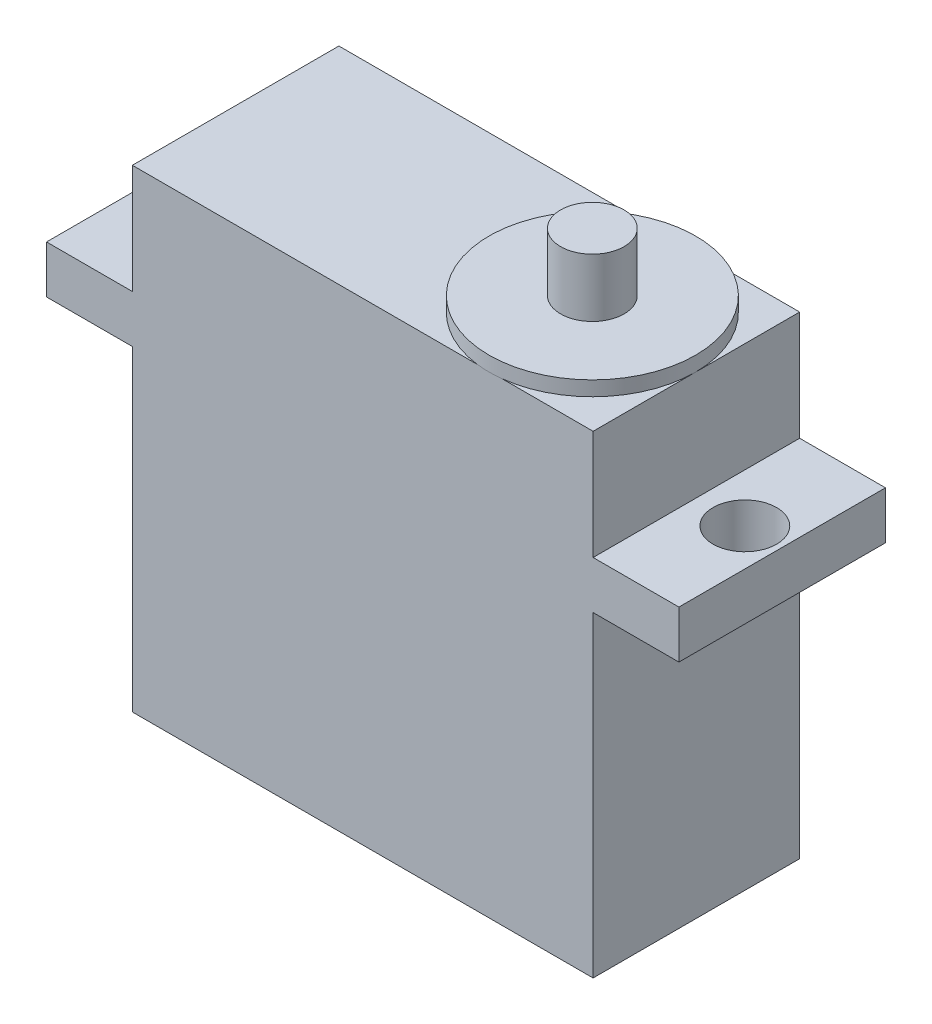
ISO-10303-21;
HEADER;
FILE_DESCRIPTION(('STEP AP214'),'2;1');
FILE_NAME('part.step','',(''),(''),'','','');
FILE_SCHEMA(('AUTOMOTIVE_DESIGN { 1 0 10303 214 1 1 1 1 }'));
ENDSEC;
DATA;
#1=APPLICATION_CONTEXT('core data for automotive mechanical design processes');
#2=APPLICATION_PROTOCOL_DEFINITION('international standard','automotive_design',2000,#1);
#3=PRODUCT_CONTEXT('',#1,'mechanical');
#4=PRODUCT('Part','Part','',(#3));
#5=PRODUCT_RELATED_PRODUCT_CATEGORY('part','',(#4));
#6=PRODUCT_DEFINITION_FORMATION('','',#4);
#7=PRODUCT_DEFINITION_CONTEXT('part definition',#1,'design');
#8=PRODUCT_DEFINITION('design','',#6,#7);
#9=PRODUCT_DEFINITION_SHAPE('','',#8);
#10=(LENGTH_UNIT() NAMED_UNIT(*) SI_UNIT(.MILLI.,.METRE.));
#11=(NAMED_UNIT(*) PLANE_ANGLE_UNIT() SI_UNIT($,.RADIAN.));
#12=(NAMED_UNIT(*) SI_UNIT($,.STERADIAN.) SOLID_ANGLE_UNIT());
#13=UNCERTAINTY_MEASURE_WITH_UNIT(LENGTH_MEASURE(1.E-05),#10,'distance_accuracy_value','');
#14=(GEOMETRIC_REPRESENTATION_CONTEXT(3) GLOBAL_UNCERTAINTY_ASSIGNED_CONTEXT((#13)) GLOBAL_UNIT_ASSIGNED_CONTEXT((#10,
#11,#12)) REPRESENTATION_CONTEXT('',''));
#15=CARTESIAN_POINT('',(0.,0.,0.));
#16=DIRECTION('',(0.,0.,1.));
#17=DIRECTION('',(1.,0.,0.));
#18=AXIS2_PLACEMENT_3D('',#15,#16,#17);
#19=CARTESIAN_POINT('',(0.,29.8,0.));
#20=DIRECTION('',(0.,-1.,0.));
#21=DIRECTION('',(0.,0.,-1.));
#22=AXIS2_PLACEMENT_3D('',#19,#20,#21);
#23=PLANE('',#22);
#24=CARTESIAN_POINT('',(22.5,29.8,-6.4527608859124));
#25=DIRECTION('',(0.,1.,0.));
#26=DIRECTION('',(0.,0.,1.));
#27=AXIS2_PLACEMENT_3D('',#24,#25,#26);
#28=CIRCLE('',#27,6.5);
#29=CARTESIAN_POINT('',(23.2822256383161,29.8,0.));
#30=VERTEX_POINT('',#29);
#31=CARTESIAN_POINT('',(29.,29.8,-6.4527608859124));
#32=VERTEX_POINT('',#31);
#33=EDGE_CURVE('E57',#30,#32,#28,.T.);
#34=ORIENTED_EDGE('',*,*,#33,.F.);
#35=DIRECTION('',(1.,0.,0.));
#36=VECTOR('',#35,1.);
#37=CARTESIAN_POINT('',(0.,29.8,0.));
#38=LINE('',#37,#36);
#39=CARTESIAN_POINT('',(29.,29.8,0.));
#40=VERTEX_POINT('',#39);
#41=EDGE_CURVE('E150',#30,#40,#38,.T.);
#42=ORIENTED_EDGE('',*,*,#41,.T.);
#43=DIRECTION('',(0.,0.,-1.));
#44=VECTOR('',#43,1.);
#45=CARTESIAN_POINT('',(29.,29.8,0.));
#46=LINE('',#45,#44);
#47=EDGE_CURVE('E398',#40,#32,#46,.T.);
#48=ORIENTED_EDGE('',*,*,#47,.T.);
#49=EDGE_LOOP('',(#34,#42,#48));
#50=FACE_BOUND('',#49,.T.);
#51=ADVANCED_FACE('F39',(#50),#23,.F.);
#52=CARTESIAN_POINT('',(0.,22.92,0.));
#53=DIRECTION('',(0.,1.,0.));
#54=DIRECTION('',(0.,0.,1.));
#55=AXIS2_PLACEMENT_3D('',#52,#53,#54);
#56=PLANE('',#55);
#57=DIRECTION('',(0.,0.,-1.));
#58=VECTOR('',#57,1.);
#59=CARTESIAN_POINT('',(29.,22.92,0.));
#60=LINE('',#59,#58);
#61=CARTESIAN_POINT('',(29.,22.92,0.));
#62=VERTEX_POINT('',#61);
#63=CARTESIAN_POINT('',(29.,22.92,-13.));
#64=VERTEX_POINT('',#63);
#65=EDGE_CURVE('E175',#62,#64,#60,.T.);
#66=ORIENTED_EDGE('',*,*,#65,.F.);
#67=DIRECTION('',(1.,0.,0.));
#68=VECTOR('',#67,1.);
#69=CARTESIAN_POINT('',(-5.4,22.92,0.));
#70=LINE('',#69,#68);
#71=CARTESIAN_POINT('',(34.4,22.92,0.));
#72=VERTEX_POINT('',#71);
#73=EDGE_CURVE('E358',#62,#72,#70,.T.);
#74=ORIENTED_EDGE('',*,*,#73,.T.);
#75=DIRECTION('',(0.,0.,-1.));
#76=VECTOR('',#75,1.);
#77=CARTESIAN_POINT('',(34.4,22.92,-13.));
#78=LINE('',#77,#76);
#79=CARTESIAN_POINT('',(34.4,22.92,-13.));
#80=VERTEX_POINT('',#79);
#81=EDGE_CURVE('E352',#72,#80,#78,.T.);
#82=ORIENTED_EDGE('',*,*,#81,.T.);
#83=DIRECTION('',(-1.,0.,0.));
#84=VECTOR('',#83,1.);
#85=CARTESIAN_POINT('',(-5.4,22.92,-13.));
#86=LINE('',#85,#84);
#87=EDGE_CURVE('E333',#80,#64,#86,.T.);
#88=ORIENTED_EDGE('',*,*,#87,.T.);
#89=EDGE_LOOP('',(#66,#74,#82,#88));
#90=FACE_BOUND('',#89,.T.);
#91=CARTESIAN_POINT('',(32.05,22.92,-6.5));
#92=DIRECTION('',(0.,1.,0.));
#93=DIRECTION('',(0.,0.,1.));
#94=AXIS2_PLACEMENT_3D('',#91,#92,#93);
#95=CIRCLE('',#94,2.);
#96=CARTESIAN_POINT('',(32.05,22.92,-4.5));
#97=VERTEX_POINT('',#96);
#98=EDGE_CURVE('E366',#97,#97,#95,.T.);
#99=ORIENTED_EDGE('',*,*,#98,.F.);
#100=EDGE_LOOP('',(#99));
#101=FACE_BOUND('',#100,.T.);
#102=ADVANCED_FACE('F205',(#90,#101),#56,.T.);
#103=CARTESIAN_POINT('',(0.,19.92,0.));
#104=DIRECTION('',(1.,0.,0.));
#105=DIRECTION('',(0.,0.,-1.));
#106=AXIS2_PLACEMENT_3D('',#103,#104,#105);
#107=PLANE('',#106);
#108=DIRECTION('',(0.,0.,1.));
#109=VECTOR('',#108,1.);
#110=CARTESIAN_POINT('',(0.,0.,0.));
#111=LINE('',#110,#109);
#112=CARTESIAN_POINT('',(0.,0.,-13.));
#113=VERTEX_POINT('',#112);
#114=CARTESIAN_POINT('',(0.,0.,0.));
#115=VERTEX_POINT('',#114);
#116=EDGE_CURVE('E273',#113,#115,#111,.T.);
#117=ORIENTED_EDGE('',*,*,#116,.T.);
#118=DIRECTION('',(0.,-1.,0.));
#119=VECTOR('',#118,1.);
#120=CARTESIAN_POINT('',(0.,19.92,0.));
#121=LINE('',#120,#119);
#122=CARTESIAN_POINT('',(0.,19.92,0.));
#123=VERTEX_POINT('',#122);
#124=EDGE_CURVE('E43',#123,#115,#121,.T.);
#125=ORIENTED_EDGE('',*,*,#124,.F.);
#126=DIRECTION('',(0.,0.,1.));
#127=VECTOR('',#126,1.);
#128=CARTESIAN_POINT('',(0.,19.92,0.));
#129=LINE('',#128,#127);
#130=CARTESIAN_POINT('',(0.,19.92,-13.));
#131=VERTEX_POINT('',#130);
#132=EDGE_CURVE('E298',#131,#123,#129,.T.);
#133=ORIENTED_EDGE('',*,*,#132,.F.);
#134=DIRECTION('',(0.,-1.,0.));
#135=VECTOR('',#134,1.);
#136=CARTESIAN_POINT('',(0.,19.92,-13.));
#137=LINE('',#136,#135);
#138=EDGE_CURVE('E276',#131,#113,#137,.T.);
#139=ORIENTED_EDGE('',*,*,#138,.T.);
#140=EDGE_LOOP('',(#117,#125,#133,#139));
#141=FACE_BOUND('',#140,.T.);
#142=ADVANCED_FACE('F41',(#141),#107,.F.);
#143=CARTESIAN_POINT('',(0.,19.92,0.));
#144=DIRECTION('',(0.,0.,-1.));
#145=DIRECTION('',(-1.,0.,0.));
#146=AXIS2_PLACEMENT_3D('',#143,#144,#145);
#147=PLANE('',#146);
#148=DIRECTION('',(1.,0.,0.));
#149=VECTOR('',#148,1.);
#150=CARTESIAN_POINT('',(0.,0.,0.));
#151=LINE('',#150,#149);
#152=CARTESIAN_POINT('',(29.,0.,0.));
#153=VERTEX_POINT('',#152);
#154=EDGE_CURVE('E279',#115,#153,#151,.T.);
#155=ORIENTED_EDGE('',*,*,#154,.T.);
#156=DIRECTION('',(0.,-1.,0.));
#157=VECTOR('',#156,1.);
#158=CARTESIAN_POINT('',(29.,19.92,0.));
#159=LINE('',#158,#157);
#160=CARTESIAN_POINT('',(29.,19.92,0.));
#161=VERTEX_POINT('',#160);
#162=EDGE_CURVE('E168',#161,#153,#159,.T.);
#163=ORIENTED_EDGE('',*,*,#162,.F.);
#164=DIRECTION('',(1.,0.,0.));
#165=VECTOR('',#164,1.);
#166=CARTESIAN_POINT('',(-5.4,19.92,0.));
#167=LINE('',#166,#165);
#168=CARTESIAN_POINT('',(34.4,19.92,0.));
#169=VERTEX_POINT('',#168);
#170=EDGE_CURVE('E316',#161,#169,#167,.T.);
#171=ORIENTED_EDGE('',*,*,#170,.T.);
#172=DIRECTION('',(0.,-1.,0.));
#173=VECTOR('',#172,1.);
#174=CARTESIAN_POINT('',(34.4,22.92,0.));
#175=LINE('',#174,#173);
#176=EDGE_CURVE('E287',#72,#169,#175,.T.);
#177=ORIENTED_EDGE('',*,*,#176,.F.);
#178=ORIENTED_EDGE('',*,*,#73,.F.);
#179=DIRECTION('',(0.,-1.,0.));
#180=VECTOR('',#179,1.);
#181=CARTESIAN_POINT('',(29.,29.8,0.));
#182=LINE('',#181,#180);
#183=EDGE_CURVE('E147',#40,#62,#182,.T.);
#184=ORIENTED_EDGE('',*,*,#183,.F.);
#185=ORIENTED_EDGE('',*,*,#41,.F.);
#186=CARTESIAN_POINT('',(21.7177743616839,29.8,0.));
#187=VERTEX_POINT('',#186);
#188=EDGE_CURVE('E148',#187,#30,#38,.T.);
#189=ORIENTED_EDGE('',*,*,#188,.F.);
#190=CARTESIAN_POINT('',(0.,29.8,0.));
#191=VERTEX_POINT('',#190);
#192=EDGE_CURVE('E138',#191,#187,#38,.T.);
#193=ORIENTED_EDGE('',*,*,#192,.F.);
#194=DIRECTION('',(0.,-1.,0.));
#195=VECTOR('',#194,1.);
#196=CARTESIAN_POINT('',(0.,29.8,0.));
#197=LINE('',#196,#195);
#198=CARTESIAN_POINT('',(0.,22.92,0.));
#199=VERTEX_POINT('',#198);
#200=EDGE_CURVE('E385',#191,#199,#197,.T.);
#201=ORIENTED_EDGE('',*,*,#200,.T.);
#202=CARTESIAN_POINT('',(-5.4,22.92,0.));
#203=VERTEX_POINT('',#202);
#204=EDGE_CURVE('E355',#203,#199,#70,.T.);
#205=ORIENTED_EDGE('',*,*,#204,.F.);
#206=DIRECTION('',(0.,-1.,0.));
#207=VECTOR('',#206,1.);
#208=CARTESIAN_POINT('',(-5.4,22.92,0.));
#209=LINE('',#208,#207);
#210=CARTESIAN_POINT('',(-5.4,19.92,0.));
#211=VERTEX_POINT('',#210);
#212=EDGE_CURVE('E280',#203,#211,#209,.T.);
#213=ORIENTED_EDGE('',*,*,#212,.T.);
#214=EDGE_CURVE('E341',#211,#123,#167,.T.);
#215=ORIENTED_EDGE('',*,*,#214,.T.);
#216=ORIENTED_EDGE('',*,*,#124,.T.);
#217=EDGE_LOOP('',(#155,#163,#171,#177,#178,#184,#185,#189,#193,#201,#205,#213,#215,#216));
#218=FACE_BOUND('',#217,.T.);
#219=ADVANCED_FACE('F153',(#218),#147,.F.);
#220=CARTESIAN_POINT('',(29.,19.92,0.));
#221=DIRECTION('',(-1.,0.,0.));
#222=DIRECTION('',(0.,0.,1.));
#223=AXIS2_PLACEMENT_3D('',#220,#221,#222);
#224=PLANE('',#223);
#225=DIRECTION('',(0.,0.,-1.));
#226=VECTOR('',#225,1.);
#227=CARTESIAN_POINT('',(29.,0.,0.));
#228=LINE('',#227,#226);
#229=CARTESIAN_POINT('',(29.,0.,-13.));
#230=VERTEX_POINT('',#229);
#231=EDGE_CURVE('E284',#153,#230,#228,.T.);
#232=ORIENTED_EDGE('',*,*,#231,.T.);
#233=DIRECTION('',(0.,-1.,0.));
#234=VECTOR('',#233,1.);
#235=CARTESIAN_POINT('',(29.,19.92,-13.));
#236=LINE('',#235,#234);
#237=CARTESIAN_POINT('',(29.,19.92,-13.));
#238=VERTEX_POINT('',#237);
#239=EDGE_CURVE('E301',#238,#230,#236,.T.);
#240=ORIENTED_EDGE('',*,*,#239,.F.);
#241=DIRECTION('',(0.,0.,-1.));
#242=VECTOR('',#241,1.);
#243=CARTESIAN_POINT('',(29.,19.92,0.));
#244=LINE('',#243,#242);
#245=EDGE_CURVE('E290',#161,#238,#244,.T.);
#246=ORIENTED_EDGE('',*,*,#245,.F.);
#247=ORIENTED_EDGE('',*,*,#162,.T.);
#248=EDGE_LOOP('',(#232,#240,#246,#247));
#249=FACE_BOUND('',#248,.T.);
#250=ADVANCED_FACE('F259',(#249),#224,.F.);
#251=CARTESIAN_POINT('',(0.,19.92,-13.));
#252=DIRECTION('',(0.,0.,1.));
#253=DIRECTION('',(1.,0.,0.));
#254=AXIS2_PLACEMENT_3D('',#251,#252,#253);
#255=PLANE('',#254);
#256=DIRECTION('',(-1.,0.,0.));
#257=VECTOR('',#256,1.);
#258=CARTESIAN_POINT('',(0.,0.,-13.));
#259=LINE('',#258,#257);
#260=EDGE_CURVE('E295',#230,#113,#259,.T.);
#261=ORIENTED_EDGE('',*,*,#260,.T.);
#262=ORIENTED_EDGE('',*,*,#138,.F.);
#263=DIRECTION('',(-1.,0.,0.));
#264=VECTOR('',#263,1.);
#265=CARTESIAN_POINT('',(-5.4,19.92,-13.));
#266=LINE('',#265,#264);
#267=CARTESIAN_POINT('',(-5.4,19.92,-13.));
#268=VERTEX_POINT('',#267);
#269=EDGE_CURVE('E337',#131,#268,#266,.T.);
#270=ORIENTED_EDGE('',*,*,#269,.T.);
#271=DIRECTION('',(0.,-1.,0.));
#272=VECTOR('',#271,1.);
#273=CARTESIAN_POINT('',(-5.4,22.92,-13.));
#274=LINE('',#273,#272);
#275=CARTESIAN_POINT('',(-5.4,22.92,-13.));
#276=VERTEX_POINT('',#275);
#277=EDGE_CURVE('E329',#276,#268,#274,.T.);
#278=ORIENTED_EDGE('',*,*,#277,.F.);
#279=CARTESIAN_POINT('',(0.,22.92,-13.));
#280=VERTEX_POINT('',#279);
#281=EDGE_CURVE('E351',#280,#276,#86,.T.);
#282=ORIENTED_EDGE('',*,*,#281,.F.);
#283=DIRECTION('',(0.,-1.,0.));
#284=VECTOR('',#283,1.);
#285=CARTESIAN_POINT('',(0.,29.8,-13.));
#286=LINE('',#285,#284);
#287=CARTESIAN_POINT('',(0.,29.8,-13.));
#288=VERTEX_POINT('',#287);
#289=EDGE_CURVE('E381',#288,#280,#286,.T.);
#290=ORIENTED_EDGE('',*,*,#289,.F.);
#291=DIRECTION('',(-1.,0.,0.));
#292=VECTOR('',#291,1.);
#293=CARTESIAN_POINT('',(0.,29.8,-13.));
#294=LINE('',#293,#292);
#295=CARTESIAN_POINT('',(29.,29.8,-13.));
#296=VERTEX_POINT('',#295);
#297=EDGE_CURVE('E396',#296,#288,#294,.T.);
#298=ORIENTED_EDGE('',*,*,#297,.F.);
#299=DIRECTION('',(0.,-1.,0.));
#300=VECTOR('',#299,1.);
#301=CARTESIAN_POINT('',(29.,29.8,-13.));
#302=LINE('',#301,#300);
#303=EDGE_CURVE('E374',#296,#64,#302,.T.);
#304=ORIENTED_EDGE('',*,*,#303,.T.);
#305=ORIENTED_EDGE('',*,*,#87,.F.);
#306=DIRECTION('',(0.,-1.,0.));
#307=VECTOR('',#306,1.);
#308=CARTESIAN_POINT('',(34.4,22.92,-13.));
#309=LINE('',#308,#307);
#310=CARTESIAN_POINT('',(34.4,19.92,-13.));
#311=VERTEX_POINT('',#310);
#312=EDGE_CURVE('E326',#80,#311,#309,.T.);
#313=ORIENTED_EDGE('',*,*,#312,.T.);
#314=EDGE_CURVE('E313',#311,#238,#266,.T.);
#315=ORIENTED_EDGE('',*,*,#314,.T.);
#316=ORIENTED_EDGE('',*,*,#239,.T.);
#317=EDGE_LOOP('',(#261,#262,#270,#278,#282,#290,#298,#304,#305,#313,#315,#316));
#318=FACE_BOUND('',#317,.T.);
#319=ADVANCED_FACE('F255',(#318),#255,.F.);
#320=CARTESIAN_POINT('',(0.,0.,0.));
#321=DIRECTION('',(0.,-1.,0.));
#322=DIRECTION('',(0.,0.,-1.));
#323=AXIS2_PLACEMENT_3D('',#320,#321,#322);
#324=PLANE('',#323);
#325=ORIENTED_EDGE('',*,*,#116,.F.);
#326=ORIENTED_EDGE('',*,*,#260,.F.);
#327=ORIENTED_EDGE('',*,*,#231,.F.);
#328=ORIENTED_EDGE('',*,*,#154,.F.);
#329=EDGE_LOOP('',(#325,#326,#327,#328));
#330=FACE_BOUND('',#329,.T.);
#331=ADVANCED_FACE('F245',(#330),#324,.T.);
#332=CARTESIAN_POINT('',(0.,19.92,0.));
#333=DIRECTION('',(0.,1.,0.));
#334=DIRECTION('',(0.,0.,1.));
#335=AXIS2_PLACEMENT_3D('',#332,#333,#334);
#336=PLANE('',#335);
#337=CARTESIAN_POINT('',(-3.05,19.92,-6.5));
#338=DIRECTION('',(0.,1.,0.));
#339=DIRECTION('',(0.,0.,1.));
#340=AXIS2_PLACEMENT_3D('',#337,#338,#339);
#341=CIRCLE('',#340,2.);
#342=CARTESIAN_POINT('',(-3.05,19.92,-4.5));
#343=VERTEX_POINT('',#342);
#344=EDGE_CURVE('E362',#343,#343,#341,.T.);
#345=ORIENTED_EDGE('',*,*,#344,.T.);
#346=EDGE_LOOP('',(#345));
#347=FACE_BOUND('',#346,.T.);
#348=ORIENTED_EDGE('',*,*,#269,.F.);
#349=ORIENTED_EDGE('',*,*,#132,.T.);
#350=ORIENTED_EDGE('',*,*,#214,.F.);
#351=DIRECTION('',(0.,0.,1.));
#352=VECTOR('',#351,1.);
#353=CARTESIAN_POINT('',(-5.4,19.92,-13.));
#354=LINE('',#353,#352);
#355=EDGE_CURVE('E344',#268,#211,#354,.T.);
#356=ORIENTED_EDGE('',*,*,#355,.F.);
#357=EDGE_LOOP('',(#348,#349,#350,#356));
#358=FACE_BOUND('',#357,.T.);
#359=ADVANCED_FACE('F242',(#347,#358),#336,.F.);
#360=CARTESIAN_POINT('',(32.05,19.92,-6.5));
#361=DIRECTION('',(0.,1.,0.));
#362=DIRECTION('',(0.,0.,1.));
#363=AXIS2_PLACEMENT_3D('',#360,#361,#362);
#364=CIRCLE('',#363,2.);
#365=CARTESIAN_POINT('',(32.05,19.92,-4.5));
#366=VERTEX_POINT('',#365);
#367=EDGE_CURVE('E370',#366,#366,#364,.T.);
#368=ORIENTED_EDGE('',*,*,#367,.T.);
#369=EDGE_LOOP('',(#368));
#370=FACE_BOUND('',#369,.T.);
#371=ORIENTED_EDGE('',*,*,#170,.F.);
#372=ORIENTED_EDGE('',*,*,#245,.T.);
#373=ORIENTED_EDGE('',*,*,#314,.F.);
#374=DIRECTION('',(0.,0.,-1.));
#375=VECTOR('',#374,1.);
#376=CARTESIAN_POINT('',(34.4,19.92,-13.));
#377=LINE('',#376,#375);
#378=EDGE_CURVE('E338',#169,#311,#377,.T.);
#379=ORIENTED_EDGE('',*,*,#378,.F.);
#380=EDGE_LOOP('',(#371,#372,#373,#379));
#381=FACE_BOUND('',#380,.T.);
#382=ADVANCED_FACE('F240',(#370,#381),#336,.F.);
#383=DIRECTION('',(0.,0.,1.));
#384=VECTOR('',#383,1.);
#385=CARTESIAN_POINT('',(0.,22.92,0.));
#386=LINE('',#385,#384);
#387=EDGE_CURVE('E180',#280,#199,#386,.T.);
#388=ORIENTED_EDGE('',*,*,#387,.F.);
#389=ORIENTED_EDGE('',*,*,#281,.T.);
#390=DIRECTION('',(0.,0.,1.));
#391=VECTOR('',#390,1.);
#392=CARTESIAN_POINT('',(-5.4,22.92,-13.));
#393=LINE('',#392,#391);
#394=EDGE_CURVE('E336',#276,#203,#393,.T.);
#395=ORIENTED_EDGE('',*,*,#394,.T.);
#396=ORIENTED_EDGE('',*,*,#204,.T.);
#397=EDGE_LOOP('',(#388,#389,#395,#396));
#398=FACE_BOUND('',#397,.T.);
#399=CARTESIAN_POINT('',(-3.05,22.92,-6.5));
#400=DIRECTION('',(0.,1.,0.));
#401=DIRECTION('',(0.,0.,1.));
#402=AXIS2_PLACEMENT_3D('',#399,#400,#401);
#403=CIRCLE('',#402,2.);
#404=CARTESIAN_POINT('',(-3.05,22.92,-4.5));
#405=VERTEX_POINT('',#404);
#406=EDGE_CURVE('E348',#405,#405,#403,.T.);
#407=ORIENTED_EDGE('',*,*,#406,.F.);
#408=EDGE_LOOP('',(#407));
#409=FACE_BOUND('',#408,.T.);
#410=ADVANCED_FACE('F212',(#398,#409),#56,.T.);
#411=CARTESIAN_POINT('',(-5.4,22.92,-13.));
#412=DIRECTION('',(1.,0.,0.));
#413=DIRECTION('',(0.,0.,-1.));
#414=AXIS2_PLACEMENT_3D('',#411,#412,#413);
#415=PLANE('',#414);
#416=ORIENTED_EDGE('',*,*,#355,.T.);
#417=ORIENTED_EDGE('',*,*,#212,.F.);
#418=ORIENTED_EDGE('',*,*,#394,.F.);
#419=ORIENTED_EDGE('',*,*,#277,.T.);
#420=EDGE_LOOP('',(#416,#417,#418,#419));
#421=FACE_BOUND('',#420,.T.);
#422=ADVANCED_FACE('F239',(#421),#415,.F.);
#423=CARTESIAN_POINT('',(34.4,22.92,-13.));
#424=DIRECTION('',(-1.,0.,0.));
#425=DIRECTION('',(0.,0.,1.));
#426=AXIS2_PLACEMENT_3D('',#423,#424,#425);
#427=PLANE('',#426);
#428=ORIENTED_EDGE('',*,*,#378,.T.);
#429=ORIENTED_EDGE('',*,*,#312,.F.);
#430=ORIENTED_EDGE('',*,*,#81,.F.);
#431=ORIENTED_EDGE('',*,*,#176,.T.);
#432=EDGE_LOOP('',(#428,#429,#430,#431));
#433=FACE_BOUND('',#432,.T.);
#434=ADVANCED_FACE('F235',(#433),#427,.F.);
#435=CARTESIAN_POINT('',(-3.05,22.92,-6.5));
#436=DIRECTION('',(0.,-1.,0.));
#437=DIRECTION('',(0.,0.,-1.));
#438=AXIS2_PLACEMENT_3D('',#435,#436,#437);
#439=CYLINDRICAL_SURFACE('',#438,2.);
#440=ORIENTED_EDGE('',*,*,#406,.T.);
#441=EDGE_LOOP('',(#440));
#442=FACE_BOUND('',#441,.T.);
#443=ORIENTED_EDGE('',*,*,#344,.F.);
#444=EDGE_LOOP('',(#443));
#445=FACE_BOUND('',#444,.T.);
#446=ADVANCED_FACE('F232',(#442,#445),#439,.F.);
#447=CARTESIAN_POINT('',(32.05,22.92,-6.5));
#448=DIRECTION('',(0.,-1.,0.));
#449=DIRECTION('',(0.,0.,-1.));
#450=AXIS2_PLACEMENT_3D('',#447,#448,#449);
#451=CYLINDRICAL_SURFACE('',#450,2.);
#452=ORIENTED_EDGE('',*,*,#98,.T.);
#453=EDGE_LOOP('',(#452));
#454=FACE_BOUND('',#453,.T.);
#455=ORIENTED_EDGE('',*,*,#367,.F.);
#456=EDGE_LOOP('',(#455));
#457=FACE_BOUND('',#456,.T.);
#458=ADVANCED_FACE('F225',(#454,#457),#451,.F.);
#459=CARTESIAN_POINT('',(29.,29.8,0.));
#460=DIRECTION('',(-1.,0.,0.));
#461=DIRECTION('',(0.,0.,1.));
#462=AXIS2_PLACEMENT_3D('',#459,#460,#461);
#463=PLANE('',#462);
#464=ORIENTED_EDGE('',*,*,#65,.T.);
#465=ORIENTED_EDGE('',*,*,#303,.F.);
#466=EDGE_CURVE('E392',#32,#296,#46,.T.);
#467=ORIENTED_EDGE('',*,*,#466,.F.);
#468=ORIENTED_EDGE('',*,*,#47,.F.);
#469=ORIENTED_EDGE('',*,*,#183,.T.);
#470=EDGE_LOOP('',(#464,#465,#467,#468,#469));
#471=FACE_BOUND('',#470,.T.);
#472=ADVANCED_FACE('F220',(#471),#463,.F.);
#473=CARTESIAN_POINT('',(0.,29.8,0.));
#474=DIRECTION('',(1.,0.,0.));
#475=DIRECTION('',(0.,0.,-1.));
#476=AXIS2_PLACEMENT_3D('',#473,#474,#475);
#477=PLANE('',#476);
#478=ORIENTED_EDGE('',*,*,#387,.T.);
#479=ORIENTED_EDGE('',*,*,#200,.F.);
#480=DIRECTION('',(0.,0.,1.));
#481=VECTOR('',#480,1.);
#482=CARTESIAN_POINT('',(0.,29.8,0.));
#483=LINE('',#482,#481);
#484=EDGE_CURVE('E142',#288,#191,#483,.T.);
#485=ORIENTED_EDGE('',*,*,#484,.F.);
#486=ORIENTED_EDGE('',*,*,#289,.T.);
#487=EDGE_LOOP('',(#478,#479,#485,#486));
#488=FACE_BOUND('',#487,.T.);
#489=ADVANCED_FACE('F215',(#488),#477,.F.);
#490=EDGE_CURVE('E49',#32,#187,#28,.T.);
#491=ORIENTED_EDGE('',*,*,#490,.F.);
#492=ORIENTED_EDGE('',*,*,#466,.T.);
#493=ORIENTED_EDGE('',*,*,#297,.T.);
#494=ORIENTED_EDGE('',*,*,#484,.T.);
#495=ORIENTED_EDGE('',*,*,#192,.T.);
#496=EDGE_LOOP('',(#491,#492,#493,#494,#495));
#497=FACE_BOUND('',#496,.T.);
#498=ADVANCED_FACE('F140',(#497),#23,.F.);
#499=CARTESIAN_POINT('',(22.5,29.8,-6.4527608859124));
#500=DIRECTION('',(0.,1.,0.));
#501=DIRECTION('',(0.,0.,1.));
#502=AXIS2_PLACEMENT_3D('',#499,#500,#501);
#503=PLANE('',#502);
#504=EDGE_CURVE('E158',#187,#30,#28,.T.);
#505=ORIENTED_EDGE('',*,*,#504,.F.);
#506=ORIENTED_EDGE('',*,*,#188,.T.);
#507=EDGE_LOOP('',(#505,#506));
#508=FACE_BOUND('',#507,.T.);
#509=ADVANCED_FACE('F159',(#508),#503,.F.);
#510=CARTESIAN_POINT('',(22.5,30.72,-6.4527608859124));
#511=DIRECTION('',(0.,-1.,0.));
#512=DIRECTION('',(0.,0.,-1.));
#513=AXIS2_PLACEMENT_3D('',#510,#511,#512);
#514=CYLINDRICAL_SURFACE('',#513,6.5);
#515=CARTESIAN_POINT('',(22.5,30.72,-6.4527608859124));
#516=DIRECTION('',(0.,1.,0.));
#517=DIRECTION('',(0.,0.,1.));
#518=AXIS2_PLACEMENT_3D('',#515,#516,#517);
#519=CIRCLE('',#518,6.5);
#520=CARTESIAN_POINT('',(22.5,30.72,0.0472391140876023));
#521=VERTEX_POINT('',#520);
#522=EDGE_CURVE('E172',#521,#521,#519,.T.);
#523=ORIENTED_EDGE('',*,*,#522,.F.);
#524=EDGE_LOOP('',(#523));
#525=FACE_BOUND('',#524,.T.);
#526=ORIENTED_EDGE('',*,*,#33,.T.);
#527=ORIENTED_EDGE('',*,*,#490,.T.);
#528=ORIENTED_EDGE('',*,*,#504,.T.);
#529=EDGE_LOOP('',(#526,#527,#528));
#530=FACE_BOUND('',#529,.T.);
#531=ADVANCED_FACE('F164',(#525,#530),#514,.T.);
#532=CARTESIAN_POINT('',(22.5,30.72,-6.4527608859124));
#533=DIRECTION('',(0.,1.,0.));
#534=DIRECTION('',(0.,0.,1.));
#535=AXIS2_PLACEMENT_3D('',#532,#533,#534);
#536=PLANE('',#535);
#537=CARTESIAN_POINT('',(22.5,30.72,-6.4527608859124));
#538=DIRECTION('',(0.,1.,0.));
#539=DIRECTION('',(0.,0.,1.));
#540=AXIS2_PLACEMENT_3D('',#537,#538,#539);
#541=CIRCLE('',#540,2.);
#542=CARTESIAN_POINT('',(22.5,30.72,-8.4527608859124));
#543=VERTEX_POINT('',#542);
#544=EDGE_CURVE('E11',#543,#543,#541,.T.);
#545=ORIENTED_EDGE('',*,*,#544,.F.);
#546=EDGE_LOOP('',(#545));
#547=FACE_BOUND('',#546,.T.);
#548=ORIENTED_EDGE('',*,*,#522,.T.);
#549=EDGE_LOOP('',(#548));
#550=FACE_BOUND('',#549,.T.);
#551=ADVANCED_FACE('F192',(#547,#550),#536,.T.);
#552=CARTESIAN_POINT('',(22.5,34.39,-6.4527608859124));
#553=DIRECTION('',(0.,-1.,0.));
#554=DIRECTION('',(0.,0.,-1.));
#555=AXIS2_PLACEMENT_3D('',#552,#553,#554);
#556=CYLINDRICAL_SURFACE('',#555,2.);
#557=CARTESIAN_POINT('',(22.5,34.39,-6.4527608859124));
#558=DIRECTION('',(0.,1.,0.));
#559=DIRECTION('',(0.,0.,1.));
#560=AXIS2_PLACEMENT_3D('',#557,#558,#559);
#561=CIRCLE('',#560,2.);
#562=CARTESIAN_POINT('',(22.5,34.39,-8.4527608859124));
#563=VERTEX_POINT('',#562);
#564=EDGE_CURVE('E162',#563,#563,#561,.T.);
#565=CARTESIAN_POINT('',(22.5,34.39,-8.4527608859124));
#566=CARTESIAN_POINT('',(22.5,34.3517708333333,-8.4527608859124));
#567=CARTESIAN_POINT('',(22.5,34.3135416666667,-8.4527608859124));
#568=CARTESIAN_POINT('',(22.5,34.2370833333333,-8.4527608859124));
#569=CARTESIAN_POINT('',(22.5,34.1988541666667,-8.4527608859124));
#570=CARTESIAN_POINT('',(22.5,34.1223958333333,-8.4527608859124));
#571=CARTESIAN_POINT('',(22.5,34.0841666666667,-8.4527608859124));
#572=CARTESIAN_POINT('',(22.5,34.0077083333333,-8.4527608859124));
#573=CARTESIAN_POINT('',(22.5,33.9694791666667,-8.4527608859124));
#574=CARTESIAN_POINT('',(22.5,33.8930208333333,-8.4527608859124));
#575=CARTESIAN_POINT('',(22.5,33.8547916666667,-8.4527608859124));
#576=CARTESIAN_POINT('',(22.5,33.7783333333333,-8.4527608859124));
#577=CARTESIAN_POINT('',(22.5,33.7401041666667,-8.4527608859124));
#578=CARTESIAN_POINT('',(22.5,33.6636458333333,-8.4527608859124));
#579=CARTESIAN_POINT('',(22.5,33.6254166666667,-8.4527608859124));
#580=CARTESIAN_POINT('',(22.5,33.5489583333333,-8.4527608859124));
#581=CARTESIAN_POINT('',(22.5,33.5107291666667,-8.4527608859124));
#582=CARTESIAN_POINT('',(22.5,33.4342708333333,-8.4527608859124));
#583=CARTESIAN_POINT('',(22.5,33.3960416666667,-8.4527608859124));
#584=CARTESIAN_POINT('',(22.5,33.3195833333333,-8.4527608859124));
#585=CARTESIAN_POINT('',(22.5,33.2813541666667,-8.4527608859124));
#586=CARTESIAN_POINT('',(22.5,33.2048958333333,-8.4527608859124));
#587=CARTESIAN_POINT('',(22.5,33.1666666666667,-8.4527608859124));
#588=CARTESIAN_POINT('',(22.5,33.0902083333333,-8.4527608859124));
#589=CARTESIAN_POINT('',(22.5,33.0519791666667,-8.4527608859124));
#590=CARTESIAN_POINT('',(22.5,32.9755208333333,-8.4527608859124));
#591=CARTESIAN_POINT('',(22.5,32.9372916666667,-8.4527608859124));
#592=CARTESIAN_POINT('',(22.5,32.8608333333333,-8.4527608859124));
#593=CARTESIAN_POINT('',(22.5,32.8226041666667,-8.4527608859124));
#594=CARTESIAN_POINT('',(22.5,32.7461458333333,-8.4527608859124));
#595=CARTESIAN_POINT('',(22.5,32.7079166666667,-8.4527608859124));
#596=CARTESIAN_POINT('',(22.5,32.6314583333333,-8.4527608859124));
#597=CARTESIAN_POINT('',(22.5,32.5932291666667,-8.4527608859124));
#598=CARTESIAN_POINT('',(22.5,32.5167708333333,-8.4527608859124));
#599=CARTESIAN_POINT('',(22.5,32.4785416666667,-8.4527608859124));
#600=CARTESIAN_POINT('',(22.5,32.4020833333333,-8.4527608859124));
#601=CARTESIAN_POINT('',(22.5,32.3638541666667,-8.4527608859124));
#602=CARTESIAN_POINT('',(22.5,32.2873958333333,-8.4527608859124));
#603=CARTESIAN_POINT('',(22.5,32.2491666666667,-8.4527608859124));
#604=CARTESIAN_POINT('',(22.5,32.1727083333333,-8.4527608859124));
#605=CARTESIAN_POINT('',(22.5,32.1344791666667,-8.4527608859124));
#606=CARTESIAN_POINT('',(22.5,32.0580208333333,-8.4527608859124));
#607=CARTESIAN_POINT('',(22.5,32.0197916666667,-8.4527608859124));
#608=CARTESIAN_POINT('',(22.5,31.9433333333333,-8.4527608859124));
#609=CARTESIAN_POINT('',(22.5,31.9051041666667,-8.4527608859124));
#610=CARTESIAN_POINT('',(22.5,31.8286458333333,-8.4527608859124));
#611=CARTESIAN_POINT('',(22.5,31.7904166666667,-8.4527608859124));
#612=CARTESIAN_POINT('',(22.5,31.7139583333333,-8.4527608859124));
#613=CARTESIAN_POINT('',(22.5,31.6757291666667,-8.4527608859124));
#614=CARTESIAN_POINT('',(22.5,31.5992708333333,-8.4527608859124));
#615=CARTESIAN_POINT('',(22.5,31.5610416666667,-8.4527608859124));
#616=CARTESIAN_POINT('',(22.5,31.4845833333333,-8.4527608859124));
#617=CARTESIAN_POINT('',(22.5,31.4463541666667,-8.4527608859124));
#618=CARTESIAN_POINT('',(22.5,31.3698958333333,-8.4527608859124));
#619=CARTESIAN_POINT('',(22.5,31.3316666666667,-8.4527608859124));
#620=CARTESIAN_POINT('',(22.5,31.2552083333333,-8.4527608859124));
#621=CARTESIAN_POINT('',(22.5,31.2169791666667,-8.4527608859124));
#622=CARTESIAN_POINT('',(22.5,31.1405208333333,-8.4527608859124));
#623=CARTESIAN_POINT('',(22.5,31.1022916666667,-8.4527608859124));
#624=CARTESIAN_POINT('',(22.5,31.0258333333333,-8.4527608859124));
#625=CARTESIAN_POINT('',(22.5,30.9876041666667,-8.4527608859124));
#626=CARTESIAN_POINT('',(22.5,30.9111458333333,-8.4527608859124));
#627=CARTESIAN_POINT('',(22.5,30.8729166666667,-8.4527608859124));
#628=CARTESIAN_POINT('',(22.5,30.7964583333333,-8.4527608859124));
#629=CARTESIAN_POINT('',(22.5,30.7582291666667,-8.4527608859124));
#630=CARTESIAN_POINT('',(22.5,30.72,-8.4527608859124));
#631=B_SPLINE_CURVE_WITH_KNOTS('',3,(#565,#566,#567,#568,#569,#570,#571,#572,#573,#574,#575,
#576,#577,#578,#579,#580,#581,#582,#583,#584,#585,#586,#587,#588,#589,#590,#591,#592,#593,#594,
#595,#596,#597,#598,#599,#600,#601,#602,#603,#604,#605,#606,#607,#608,#609,#610,#611,#612,#613,
#614,#615,#616,#617,#618,#619,#620,#621,#622,#623,#624,#625,#626,#627,#628,#629,#630),
.UNSPECIFIED.,.F.,.F.,(4,2,2,2,2,2,2,2,2,2,2,2,2,2,2,2,2,2,2,2,2,2,2,2,2,2,2,2,2,2,2,2,4),(0.,
0.114687500000002,0.229375000000004,0.344062500000006,0.458750000000001,0.573437500000003,
0.688125000000005,0.8028125,0.917500000000002,1.0321875,1.14687500000001,1.2615625,1.37625,
1.4909375,1.605625,1.7203125,1.835,1.94968750000001,2.064375,2.1790625,2.29375,2.4084375,
2.523125,2.6378125,2.7525,2.8671875,2.981875,3.0965625,3.21125,3.3259375,3.440625,3.5553125,
3.67),.UNSPECIFIED.);
#632=EDGE_CURVE('BSEAM189',#563,#543,#631,.T.);
#633=ORIENTED_EDGE('',*,*,#564,.F.);
#634=ORIENTED_EDGE('',*,*,#544,.T.);
#635=ORIENTED_EDGE('',*,*,#632,.T.);
#636=ORIENTED_EDGE('',*,*,#632,.F.);
#637=EDGE_LOOP('',(#633,#635,#634,#636));
#638=FACE_BOUND('',#637,.T.);
#639=ADVANCED_FACE('F189',(#638),#556,.T.);
#640=CARTESIAN_POINT('',(22.5,34.39,-6.4527608859124));
#641=DIRECTION('',(0.,1.,0.));
#642=DIRECTION('',(0.,0.,1.));
#643=AXIS2_PLACEMENT_3D('',#640,#641,#642);
#644=PLANE('',#643);
#645=ORIENTED_EDGE('',*,*,#564,.T.);
#646=EDGE_LOOP('',(#645));
#647=FACE_BOUND('',#646,.T.);
#648=ADVANCED_FACE('F187',(#647),#644,.T.);
#649=CLOSED_SHELL('',(#51,#102,#142,#219,#250,#319,#331,#359,#382,#410,#422,#434,#446,#458,#472,
#489,#498,#509,#531,#551,#639,#648));
#650=MANIFOLD_SOLID_BREP('B2',#649);
#651=ADVANCED_BREP_SHAPE_REPRESENTATION('',(#18,#650),#14);
#652=SHAPE_DEFINITION_REPRESENTATION(#9,#651);
ENDSEC;
END-ISO-10303-21;
